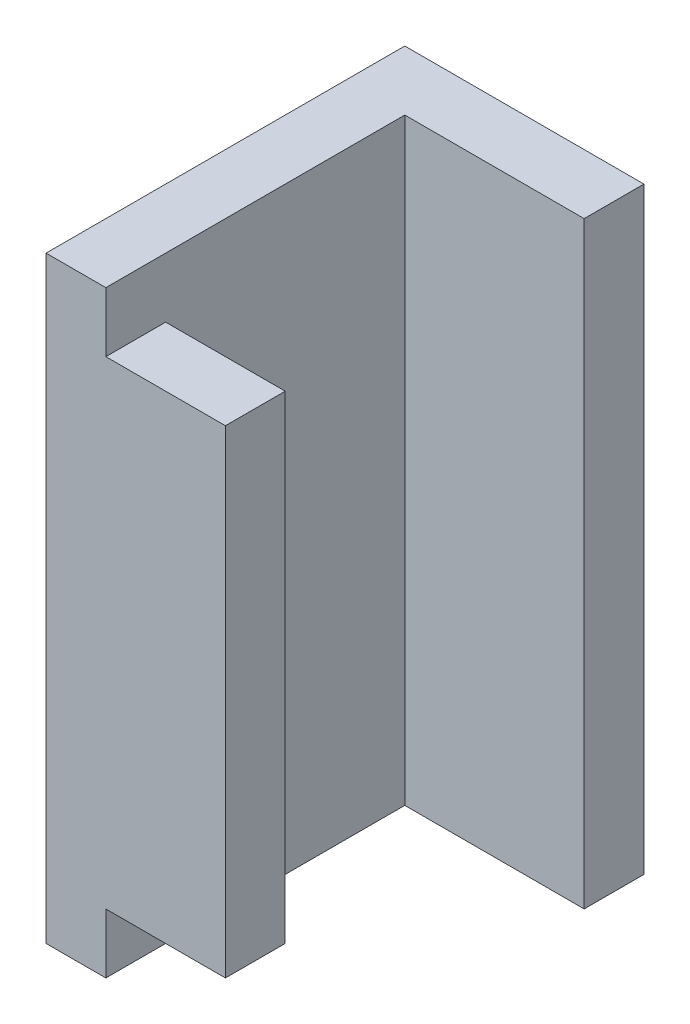
ISO-10303-21;
HEADER;
FILE_DESCRIPTION(('STEP AP214'),'2;1');
FILE_NAME('part.step','',(''),(''),'','','');
FILE_SCHEMA(('AUTOMOTIVE_DESIGN { 1 0 10303 214 1 1 1 1 }'));
ENDSEC;
DATA;
#1=APPLICATION_CONTEXT('core data for automotive mechanical design processes');
#2=APPLICATION_PROTOCOL_DEFINITION('international standard','automotive_design',2000,#1);
#3=PRODUCT_CONTEXT('',#1,'mechanical');
#4=PRODUCT('Part','Part','',(#3));
#5=PRODUCT_RELATED_PRODUCT_CATEGORY('part','',(#4));
#6=PRODUCT_DEFINITION_FORMATION('','',#4);
#7=PRODUCT_DEFINITION_CONTEXT('part definition',#1,'design');
#8=PRODUCT_DEFINITION('design','',#6,#7);
#9=PRODUCT_DEFINITION_SHAPE('','',#8);
#10=(LENGTH_UNIT() NAMED_UNIT(*) SI_UNIT(.MILLI.,.METRE.));
#11=(NAMED_UNIT(*) PLANE_ANGLE_UNIT() SI_UNIT($,.RADIAN.));
#12=(NAMED_UNIT(*) SI_UNIT($,.STERADIAN.) SOLID_ANGLE_UNIT());
#13=UNCERTAINTY_MEASURE_WITH_UNIT(LENGTH_MEASURE(1.E-05),#10,'distance_accuracy_value','');
#14=(GEOMETRIC_REPRESENTATION_CONTEXT(3) GLOBAL_UNCERTAINTY_ASSIGNED_CONTEXT((#13)) GLOBAL_UNIT_ASSIGNED_CONTEXT((#10,
#11,#12)) REPRESENTATION_CONTEXT('',''));
#15=CARTESIAN_POINT('',(0.,0.,0.));
#16=DIRECTION('',(0.,0.,1.));
#17=DIRECTION('',(1.,0.,0.));
#18=AXIS2_PLACEMENT_3D('',#15,#16,#17);
#19=CARTESIAN_POINT('',(-0.35,0.2,0.25));
#20=DIRECTION('',(0.,-1.,0.));
#21=DIRECTION('',(0.,0.,-1.));
#22=AXIS2_PLACEMENT_3D('',#19,#20,#21);
#23=PLANE('',#22);
#24=DIRECTION('',(-1.,0.,0.));
#25=VECTOR('',#24,1.);
#26=CARTESIAN_POINT('',(-0.35,0.2,0.3));
#27=LINE('',#26,#25);
#28=CARTESIAN_POINT('',(-0.35,0.2,0.3));
#29=VERTEX_POINT('',#28);
#30=CARTESIAN_POINT('',(-0.45,0.2,0.3));
#31=VERTEX_POINT('',#30);
#32=EDGE_CURVE('E162',#29,#31,#27,.T.);
#33=ORIENTED_EDGE('',*,*,#32,.F.);
#34=DIRECTION('',(0.,0.,-1.));
#35=VECTOR('',#34,1.);
#36=CARTESIAN_POINT('',(-0.35,0.2,0.3));
#37=LINE('',#36,#35);
#38=CARTESIAN_POINT('',(-0.35,0.2,0.25));
#39=VERTEX_POINT('',#38);
#40=EDGE_CURVE('E141',#29,#39,#37,.T.);
#41=ORIENTED_EDGE('',*,*,#40,.T.);
#42=DIRECTION('',(-1.,0.,0.));
#43=VECTOR('',#42,1.);
#44=CARTESIAN_POINT('',(-0.35,0.2,0.25));
#45=LINE('',#44,#43);
#46=CARTESIAN_POINT('',(-0.45,0.2,0.25));
#47=VERTEX_POINT('',#46);
#48=EDGE_CURVE('E11',#39,#47,#45,.T.);
#49=ORIENTED_EDGE('',*,*,#48,.T.);
#50=DIRECTION('',(0.,0.,-1.));
#51=VECTOR('',#50,1.);
#52=CARTESIAN_POINT('',(-0.45,0.2,0.3));
#53=LINE('',#52,#51);
#54=EDGE_CURVE('E157',#31,#47,#53,.T.);
#55=ORIENTED_EDGE('',*,*,#54,.F.);
#56=EDGE_LOOP('',(#33,#41,#49,#55));
#57=FACE_BOUND('',#56,.T.);
#58=ADVANCED_FACE('F17',(#57),#23,.F.);
#59=CARTESIAN_POINT('',(-0.45,-0.25,0.25));
#60=DIRECTION('',(0.,0.,1.));
#61=DIRECTION('',(1.,0.,0.));
#62=AXIS2_PLACEMENT_3D('',#59,#60,#61);
#63=PLANE('',#62);
#64=DIRECTION('',(0.,-1.,0.));
#65=VECTOR('',#64,1.);
#66=CARTESIAN_POINT('',(-0.35,0.2,0.25));
#67=LINE('',#66,#65);
#68=CARTESIAN_POINT('',(-0.35,-0.2,0.25));
#69=VERTEX_POINT('',#68);
#70=EDGE_CURVE('E149',#39,#69,#67,.T.);
#71=ORIENTED_EDGE('',*,*,#70,.T.);
#72=DIRECTION('',(1.,0.,0.));
#73=VECTOR('',#72,1.);
#74=CARTESIAN_POINT('',(-0.45,-0.2,0.25));
#75=LINE('',#74,#73);
#76=CARTESIAN_POINT('',(-0.45,-0.2,0.25));
#77=VERTEX_POINT('',#76);
#78=EDGE_CURVE('E146',#77,#69,#75,.T.);
#79=ORIENTED_EDGE('',*,*,#78,.F.);
#80=DIRECTION('',(0.,-1.,0.));
#81=VECTOR('',#80,1.);
#82=CARTESIAN_POINT('',(-0.45,0.2,0.25));
#83=LINE('',#82,#81);
#84=EDGE_CURVE('E202',#47,#77,#83,.T.);
#85=ORIENTED_EDGE('',*,*,#84,.F.);
#86=ORIENTED_EDGE('',*,*,#48,.F.);
#87=EDGE_LOOP('',(#71,#79,#85,#86));
#88=FACE_BOUND('',#87,.T.);
#89=ADVANCED_FACE('F19',(#88),#63,.F.);
#90=CARTESIAN_POINT('',(-0.3,-0.25,0.));
#91=DIRECTION('',(0.,0.,-1.));
#92=DIRECTION('',(0.,-1.,0.));
#93=AXIS2_PLACEMENT_3D('',#90,#91,#92);
#94=PLANE('',#93);
#95=DIRECTION('',(1.,0.,0.));
#96=VECTOR('',#95,1.);
#97=CARTESIAN_POINT('',(-0.5,0.25,0.));
#98=LINE('',#97,#96);
#99=CARTESIAN_POINT('',(-0.5,0.25,0.));
#100=VERTEX_POINT('',#99);
#101=CARTESIAN_POINT('',(-0.3,0.25,0.));
#102=VERTEX_POINT('',#101);
#103=EDGE_CURVE('E215',#100,#102,#98,.T.);
#104=ORIENTED_EDGE('',*,*,#103,.T.);
#105=DIRECTION('',(0.,-1.,0.));
#106=VECTOR('',#105,1.);
#107=CARTESIAN_POINT('',(-0.3,0.25,0.));
#108=LINE('',#107,#106);
#109=CARTESIAN_POINT('',(-0.3,-0.25,0.));
#110=VERTEX_POINT('',#109);
#111=EDGE_CURVE('E26',#102,#110,#108,.T.);
#112=ORIENTED_EDGE('',*,*,#111,.T.);
#113=DIRECTION('',(1.,0.,0.));
#114=VECTOR('',#113,1.);
#115=CARTESIAN_POINT('',(-0.5,-0.25,0.));
#116=LINE('',#115,#114);
#117=CARTESIAN_POINT('',(-0.5,-0.25,0.));
#118=VERTEX_POINT('',#117);
#119=EDGE_CURVE('E177',#118,#110,#116,.T.);
#120=ORIENTED_EDGE('',*,*,#119,.F.);
#121=DIRECTION('',(0.,-1.,0.));
#122=VECTOR('',#121,1.);
#123=CARTESIAN_POINT('',(-0.5,0.25,0.));
#124=LINE('',#123,#122);
#125=EDGE_CURVE('E216',#100,#118,#124,.T.);
#126=ORIENTED_EDGE('',*,*,#125,.F.);
#127=EDGE_LOOP('',(#104,#112,#120,#126));
#128=FACE_BOUND('',#127,.T.);
#129=ADVANCED_FACE('F251',(#128),#94,.T.);
#130=CARTESIAN_POINT('',(-0.3,-0.25,0.05));
#131=DIRECTION('',(-1.,0.,0.));
#132=DIRECTION('',(0.,0.,1.));
#133=AXIS2_PLACEMENT_3D('',#130,#131,#132);
#134=PLANE('',#133);
#135=DIRECTION('',(0.,0.,1.));
#136=VECTOR('',#135,1.);
#137=CARTESIAN_POINT('',(-0.3,0.25,0.));
#138=LINE('',#137,#136);
#139=CARTESIAN_POINT('',(-0.3,0.25,0.05));
#140=VERTEX_POINT('',#139);
#141=EDGE_CURVE('E212',#102,#140,#138,.T.);
#142=ORIENTED_EDGE('',*,*,#141,.T.);
#143=DIRECTION('',(0.,-1.,0.));
#144=VECTOR('',#143,1.);
#145=CARTESIAN_POINT('',(-0.3,0.25,0.05));
#146=LINE('',#145,#144);
#147=CARTESIAN_POINT('',(-0.3,-0.25,0.05));
#148=VERTEX_POINT('',#147);
#149=EDGE_CURVE('E38',#140,#148,#146,.T.);
#150=ORIENTED_EDGE('',*,*,#149,.T.);
#151=DIRECTION('',(0.,0.,1.));
#152=VECTOR('',#151,1.);
#153=CARTESIAN_POINT('',(-0.3,-0.25,0.));
#154=LINE('',#153,#152);
#155=EDGE_CURVE('E172',#110,#148,#154,.T.);
#156=ORIENTED_EDGE('',*,*,#155,.F.);
#157=ORIENTED_EDGE('',*,*,#111,.F.);
#158=EDGE_LOOP('',(#142,#150,#156,#157));
#159=FACE_BOUND('',#158,.T.);
#160=ADVANCED_FACE('F256',(#159),#134,.F.);
#161=CARTESIAN_POINT('',(-0.3,-0.25,0.05));
#162=DIRECTION('',(0.,0.,-1.));
#163=DIRECTION('',(0.,-1.,0.));
#164=AXIS2_PLACEMENT_3D('',#161,#162,#163);
#165=PLANE('',#164);
#166=DIRECTION('',(1.,0.,0.));
#167=VECTOR('',#166,1.);
#168=CARTESIAN_POINT('',(-0.45,0.25,0.05));
#169=LINE('',#168,#167);
#170=CARTESIAN_POINT('',(-0.45,0.25,0.05));
#171=VERTEX_POINT('',#170);
#172=EDGE_CURVE('E208',#171,#140,#169,.T.);
#173=ORIENTED_EDGE('',*,*,#172,.F.);
#174=DIRECTION('',(0.,-1.,0.));
#175=VECTOR('',#174,1.);
#176=CARTESIAN_POINT('',(-0.45,0.25,0.05));
#177=LINE('',#176,#175);
#178=CARTESIAN_POINT('',(-0.45,-0.25,0.05));
#179=VERTEX_POINT('',#178);
#180=EDGE_CURVE('E201',#171,#179,#177,.T.);
#181=ORIENTED_EDGE('',*,*,#180,.T.);
#182=DIRECTION('',(1.,0.,0.));
#183=VECTOR('',#182,1.);
#184=CARTESIAN_POINT('',(-0.45,-0.25,0.05));
#185=LINE('',#184,#183);
#186=EDGE_CURVE('E176',#179,#148,#185,.T.);
#187=ORIENTED_EDGE('',*,*,#186,.T.);
#188=ORIENTED_EDGE('',*,*,#149,.F.);
#189=EDGE_LOOP('',(#173,#181,#187,#188));
#190=FACE_BOUND('',#189,.T.);
#191=ADVANCED_FACE('F260',(#190),#165,.F.);
#192=CARTESIAN_POINT('',(-0.45,-0.25,0.25));
#193=DIRECTION('',(0.,-1.,0.));
#194=DIRECTION('',(0.,0.,-1.));
#195=AXIS2_PLACEMENT_3D('',#192,#193,#194);
#196=PLANE('',#195);
#197=DIRECTION('',(0.,0.,-1.));
#198=VECTOR('',#197,1.);
#199=CARTESIAN_POINT('',(-0.45,-0.25,0.3));
#200=LINE('',#199,#198);
#201=CARTESIAN_POINT('',(-0.45,-0.25,0.3));
#202=VERTEX_POINT('',#201);
#203=EDGE_CURVE('E197',#202,#179,#200,.T.);
#204=ORIENTED_EDGE('',*,*,#203,.F.);
#205=DIRECTION('',(-1.,0.,0.));
#206=VECTOR('',#205,1.);
#207=CARTESIAN_POINT('',(-0.45,-0.25,0.3));
#208=LINE('',#207,#206);
#209=CARTESIAN_POINT('',(-0.5,-0.25,0.3));
#210=VERTEX_POINT('',#209);
#211=EDGE_CURVE('E178',#202,#210,#208,.T.);
#212=ORIENTED_EDGE('',*,*,#211,.T.);
#213=DIRECTION('',(0.,0.,-1.));
#214=VECTOR('',#213,1.);
#215=CARTESIAN_POINT('',(-0.5,-0.25,0.3));
#216=LINE('',#215,#214);
#217=EDGE_CURVE('E220',#210,#118,#216,.T.);
#218=ORIENTED_EDGE('',*,*,#217,.T.);
#219=ORIENTED_EDGE('',*,*,#119,.T.);
#220=ORIENTED_EDGE('',*,*,#155,.T.);
#221=ORIENTED_EDGE('',*,*,#186,.F.);
#222=EDGE_LOOP('',(#204,#212,#218,#219,#220,#221));
#223=FACE_BOUND('',#222,.T.);
#224=ADVANCED_FACE('F267',(#223),#196,.T.);
#225=CARTESIAN_POINT('',(-0.5,-0.25,0.05));
#226=DIRECTION('',(-1.,0.,0.));
#227=DIRECTION('',(0.,0.,1.));
#228=AXIS2_PLACEMENT_3D('',#225,#226,#227);
#229=PLANE('',#228);
#230=DIRECTION('',(0.,0.,-1.));
#231=VECTOR('',#230,1.);
#232=CARTESIAN_POINT('',(-0.5,0.25,0.3));
#233=LINE('',#232,#231);
#234=CARTESIAN_POINT('',(-0.5,0.25,0.3));
#235=VERTEX_POINT('',#234);
#236=EDGE_CURVE('E221',#235,#100,#233,.T.);
#237=ORIENTED_EDGE('',*,*,#236,.T.);
#238=ORIENTED_EDGE('',*,*,#125,.T.);
#239=ORIENTED_EDGE('',*,*,#217,.F.);
#240=DIRECTION('',(0.,-1.,0.));
#241=VECTOR('',#240,1.);
#242=CARTESIAN_POINT('',(-0.5,0.25,0.3));
#243=LINE('',#242,#241);
#244=EDGE_CURVE('E183',#235,#210,#243,.T.);
#245=ORIENTED_EDGE('',*,*,#244,.F.);
#246=EDGE_LOOP('',(#237,#238,#239,#245));
#247=FACE_BOUND('',#246,.T.);
#248=ADVANCED_FACE('F283',(#247),#229,.T.);
#249=CARTESIAN_POINT('',(-0.45,0.25,0.05));
#250=DIRECTION('',(0.,-1.,0.));
#251=DIRECTION('',(0.,0.,-1.));
#252=AXIS2_PLACEMENT_3D('',#249,#250,#251);
#253=PLANE('',#252);
#254=DIRECTION('',(-1.,0.,0.));
#255=VECTOR('',#254,1.);
#256=CARTESIAN_POINT('',(-0.45,0.25,0.3));
#257=LINE('',#256,#255);
#258=CARTESIAN_POINT('',(-0.45,0.25,0.3));
#259=VERTEX_POINT('',#258);
#260=EDGE_CURVE('E187',#259,#235,#257,.T.);
#261=ORIENTED_EDGE('',*,*,#260,.F.);
#262=DIRECTION('',(0.,0.,-1.));
#263=VECTOR('',#262,1.);
#264=CARTESIAN_POINT('',(-0.45,0.25,0.3));
#265=LINE('',#264,#263);
#266=EDGE_CURVE('E182',#259,#171,#265,.T.);
#267=ORIENTED_EDGE('',*,*,#266,.T.);
#268=ORIENTED_EDGE('',*,*,#172,.T.);
#269=ORIENTED_EDGE('',*,*,#141,.F.);
#270=ORIENTED_EDGE('',*,*,#103,.F.);
#271=ORIENTED_EDGE('',*,*,#236,.F.);
#272=EDGE_LOOP('',(#261,#267,#268,#269,#270,#271));
#273=FACE_BOUND('',#272,.T.);
#274=ADVANCED_FACE('F297',(#273),#253,.F.);
#275=CARTESIAN_POINT('',(-0.45,-0.25,0.05));
#276=DIRECTION('',(-1.,0.,0.));
#277=DIRECTION('',(0.,0.,1.));
#278=AXIS2_PLACEMENT_3D('',#275,#276,#277);
#279=PLANE('',#278);
#280=ORIENTED_EDGE('',*,*,#266,.F.);
#281=DIRECTION('',(0.,1.,0.));
#282=VECTOR('',#281,1.);
#283=CARTESIAN_POINT('',(-0.45,0.2,0.3));
#284=LINE('',#283,#282);
#285=EDGE_CURVE('E165',#31,#259,#284,.T.);
#286=ORIENTED_EDGE('',*,*,#285,.F.);
#287=ORIENTED_EDGE('',*,*,#54,.T.);
#288=ORIENTED_EDGE('',*,*,#84,.T.);
#289=DIRECTION('',(0.,0.,-1.));
#290=VECTOR('',#289,1.);
#291=CARTESIAN_POINT('',(-0.45,-0.2,0.3));
#292=LINE('',#291,#290);
#293=CARTESIAN_POINT('',(-0.45,-0.2,0.3));
#294=VERTEX_POINT('',#293);
#295=EDGE_CURVE('E133',#294,#77,#292,.T.);
#296=ORIENTED_EDGE('',*,*,#295,.F.);
#297=DIRECTION('',(0.,1.,0.));
#298=VECTOR('',#297,1.);
#299=CARTESIAN_POINT('',(-0.45,-0.25,0.3));
#300=LINE('',#299,#298);
#301=EDGE_CURVE('E127',#202,#294,#300,.T.);
#302=ORIENTED_EDGE('',*,*,#301,.F.);
#303=ORIENTED_EDGE('',*,*,#203,.T.);
#304=ORIENTED_EDGE('',*,*,#180,.F.);
#305=EDGE_LOOP('',(#280,#286,#287,#288,#296,#302,#303,#304));
#306=FACE_BOUND('',#305,.T.);
#307=ADVANCED_FACE('F301',(#306),#279,.F.);
#308=CARTESIAN_POINT('',(-0.45,-0.25,0.3));
#309=DIRECTION('',(0.,0.,1.));
#310=DIRECTION('',(1.,0.,0.));
#311=AXIS2_PLACEMENT_3D('',#308,#309,#310);
#312=PLANE('',#311);
#313=ORIENTED_EDGE('',*,*,#301,.T.);
#314=DIRECTION('',(1.,0.,0.));
#315=VECTOR('',#314,1.);
#316=CARTESIAN_POINT('',(-0.45,-0.2,0.3));
#317=LINE('',#316,#315);
#318=CARTESIAN_POINT('',(-0.35,-0.2,0.3));
#319=VERTEX_POINT('',#318);
#320=EDGE_CURVE('E119',#294,#319,#317,.T.);
#321=ORIENTED_EDGE('',*,*,#320,.T.);
#322=DIRECTION('',(0.,-1.,0.));
#323=VECTOR('',#322,1.);
#324=CARTESIAN_POINT('',(-0.35,0.2,0.3));
#325=LINE('',#324,#323);
#326=EDGE_CURVE('E123',#29,#319,#325,.T.);
#327=ORIENTED_EDGE('',*,*,#326,.F.);
#328=ORIENTED_EDGE('',*,*,#32,.T.);
#329=ORIENTED_EDGE('',*,*,#285,.T.);
#330=ORIENTED_EDGE('',*,*,#260,.T.);
#331=ORIENTED_EDGE('',*,*,#244,.T.);
#332=ORIENTED_EDGE('',*,*,#211,.F.);
#333=EDGE_LOOP('',(#313,#321,#327,#328,#329,#330,#331,#332));
#334=FACE_BOUND('',#333,.T.);
#335=ADVANCED_FACE('F121',(#334),#312,.T.);
#336=CARTESIAN_POINT('',(-0.35,-0.2,0.25));
#337=DIRECTION('',(0.,1.,0.));
#338=DIRECTION('',(1.,0.,0.));
#339=AXIS2_PLACEMENT_3D('',#336,#337,#338);
#340=PLANE('',#339);
#341=ORIENTED_EDGE('',*,*,#320,.F.);
#342=ORIENTED_EDGE('',*,*,#295,.T.);
#343=ORIENTED_EDGE('',*,*,#78,.T.);
#344=DIRECTION('',(0.,0.,-1.));
#345=VECTOR('',#344,1.);
#346=CARTESIAN_POINT('',(-0.35,-0.2,0.3));
#347=LINE('',#346,#345);
#348=EDGE_CURVE('E139',#319,#69,#347,.T.);
#349=ORIENTED_EDGE('',*,*,#348,.F.);
#350=EDGE_LOOP('',(#341,#342,#343,#349));
#351=FACE_BOUND('',#350,.T.);
#352=ADVANCED_FACE('F144',(#351),#340,.F.);
#353=CARTESIAN_POINT('',(-0.35,-0.25,0.25));
#354=DIRECTION('',(1.,0.,0.));
#355=DIRECTION('',(0.,1.,0.));
#356=AXIS2_PLACEMENT_3D('',#353,#354,#355);
#357=PLANE('',#356);
#358=ORIENTED_EDGE('',*,*,#348,.T.);
#359=ORIENTED_EDGE('',*,*,#70,.F.);
#360=ORIENTED_EDGE('',*,*,#40,.F.);
#361=ORIENTED_EDGE('',*,*,#326,.T.);
#362=EDGE_LOOP('',(#358,#359,#360,#361));
#363=FACE_BOUND('',#362,.T.);
#364=ADVANCED_FACE('F137',(#363),#357,.T.);
#365=CLOSED_SHELL('',(#58,#89,#129,#160,#191,#224,#248,#274,#307,#335,#352,#364));
#366=MANIFOLD_SOLID_BREP('B1',#365);
#367=ADVANCED_BREP_SHAPE_REPRESENTATION('',(#18,#366),#14);
#368=SHAPE_DEFINITION_REPRESENTATION(#9,#367);
ENDSEC;
END-ISO-10303-21;
